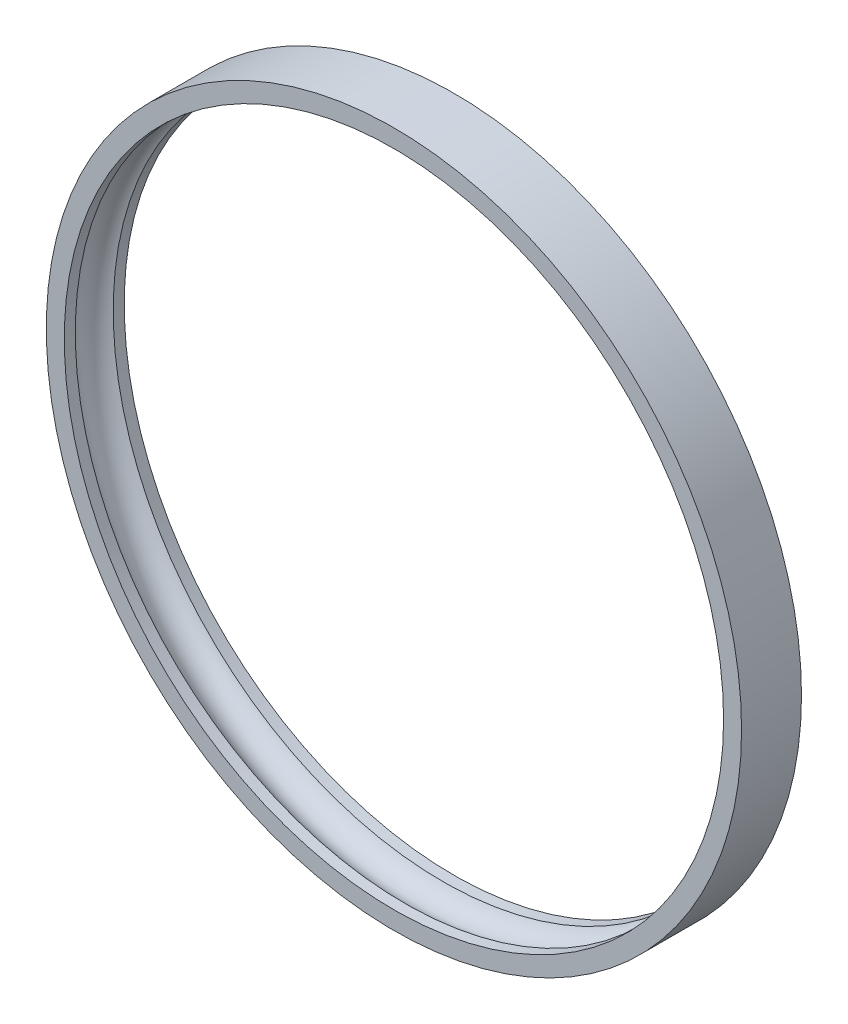
ISO-10303-21;
HEADER;
FILE_DESCRIPTION(('STEP AP214'),'2;1');
FILE_NAME('part.step','',(''),(''),'','','');
FILE_SCHEMA(('AUTOMOTIVE_DESIGN { 1 0 10303 214 1 1 1 1 }'));
ENDSEC;
DATA;
#1=APPLICATION_CONTEXT('core data for automotive mechanical design processes');
#2=APPLICATION_PROTOCOL_DEFINITION('international standard','automotive_design',2000,#1);
#3=PRODUCT_CONTEXT('',#1,'mechanical');
#4=PRODUCT('Part','Part','',(#3));
#5=PRODUCT_RELATED_PRODUCT_CATEGORY('part','',(#4));
#6=PRODUCT_DEFINITION_FORMATION('','',#4);
#7=PRODUCT_DEFINITION_CONTEXT('part definition',#1,'design');
#8=PRODUCT_DEFINITION('design','',#6,#7);
#9=PRODUCT_DEFINITION_SHAPE('','',#8);
#10=(LENGTH_UNIT() NAMED_UNIT(*) SI_UNIT(.MILLI.,.METRE.));
#11=(NAMED_UNIT(*) PLANE_ANGLE_UNIT() SI_UNIT($,.RADIAN.));
#12=(NAMED_UNIT(*) SI_UNIT($,.STERADIAN.) SOLID_ANGLE_UNIT());
#13=UNCERTAINTY_MEASURE_WITH_UNIT(LENGTH_MEASURE(1.E-05),#10,'distance_accuracy_value','');
#14=(GEOMETRIC_REPRESENTATION_CONTEXT(3) GLOBAL_UNCERTAINTY_ASSIGNED_CONTEXT((#13)) GLOBAL_UNIT_ASSIGNED_CONTEXT((#10,
#11,#12)) REPRESENTATION_CONTEXT('',''));
#15=CARTESIAN_POINT('',(0.,0.,0.));
#16=DIRECTION('',(0.,0.,1.));
#17=DIRECTION('',(1.,0.,0.));
#18=AXIS2_PLACEMENT_3D('',#15,#16,#17);
#19=CARTESIAN_POINT('',(0.,-110.,0.));
#20=DIRECTION('',(0.,0.,1.));
#21=DIRECTION('',(1.,0.,0.));
#22=AXIS2_PLACEMENT_3D('',#19,#20,#21);
#23=CYLINDRICAL_SURFACE('',#22,110.);
#24=CARTESIAN_POINT('',(0.,-110.,6.32455532033676));
#25=DIRECTION('',(0.,0.,1.));
#26=DIRECTION('',(1.,0.,0.));
#27=AXIS2_PLACEMENT_3D('',#24,#25,#26);
#28=CIRCLE('',#27,110.);
#29=CARTESIAN_POINT('',(110.,-110.,6.32455532033676));
#30=VERTEX_POINT('',#29);
#31=EDGE_CURVE('E11',#30,#30,#28,.T.);
#32=ORIENTED_EDGE('',*,*,#31,.F.);
#33=EDGE_LOOP('',(#32));
#34=FACE_BOUND('',#33,.T.);
#35=CARTESIAN_POINT('',(0.,-110.,10.));
#36=DIRECTION('',(0.,0.,1.));
#37=DIRECTION('',(1.,0.,0.));
#38=AXIS2_PLACEMENT_3D('',#35,#36,#37);
#39=CIRCLE('',#38,110.);
#40=CARTESIAN_POINT('',(110.,-110.,10.));
#41=VERTEX_POINT('',#40);
#42=EDGE_CURVE('E68',#41,#41,#39,.T.);
#43=ORIENTED_EDGE('',*,*,#42,.T.);
#44=EDGE_LOOP('',(#43));
#45=FACE_BOUND('',#44,.T.);
#46=ADVANCED_FACE('F41',(#34,#45),#23,.F.);
#47=CARTESIAN_POINT('',(0.,-110.,0.));
#48=DIRECTION('',(0.,0.,1.));
#49=DIRECTION('',(1.,0.,0.));
#50=AXIS2_PLACEMENT_3D('',#47,#48,#49);
#51=TOROIDAL_SURFACE('',#50,107.,7.);
#52=CARTESIAN_POINT('',(0.,-110.,-6.32455532033676));
#53=DIRECTION('',(0.,0.,1.));
#54=DIRECTION('',(1.,0.,0.));
#55=AXIS2_PLACEMENT_3D('',#52,#53,#54);
#56=CIRCLE('',#55,110.);
#57=CARTESIAN_POINT('',(110.,-110.,-6.32455532033676));
#58=VERTEX_POINT('',#57);
#59=EDGE_CURVE('E48',#58,#58,#56,.T.);
#60=ORIENTED_EDGE('',*,*,#59,.F.);
#61=EDGE_LOOP('',(#60));
#62=FACE_BOUND('',#61,.T.);
#63=ORIENTED_EDGE('',*,*,#31,.T.);
#64=EDGE_LOOP('',(#63));
#65=FACE_BOUND('',#64,.T.);
#66=ADVANCED_FACE('F94',(#62,#65),#51,.F.);
#67=CARTESIAN_POINT('',(0.,-110.,0.));
#68=DIRECTION('',(0.,0.,1.));
#69=DIRECTION('',(1.,0.,0.));
#70=AXIS2_PLACEMENT_3D('',#67,#68,#69);
#71=CYLINDRICAL_SURFACE('',#70,110.);
#72=CARTESIAN_POINT('',(0.,-110.,-10.));
#73=DIRECTION('',(0.,0.,1.));
#74=DIRECTION('',(1.,0.,0.));
#75=AXIS2_PLACEMENT_3D('',#72,#73,#74);
#76=CIRCLE('',#75,110.);
#77=CARTESIAN_POINT('',(110.,-110.,-10.));
#78=VERTEX_POINT('',#77);
#79=EDGE_CURVE('E53',#78,#78,#76,.T.);
#80=ORIENTED_EDGE('',*,*,#79,.F.);
#81=EDGE_LOOP('',(#80));
#82=FACE_BOUND('',#81,.T.);
#83=ORIENTED_EDGE('',*,*,#59,.T.);
#84=EDGE_LOOP('',(#83));
#85=FACE_BOUND('',#84,.T.);
#86=ADVANCED_FACE('F89',(#82,#85),#71,.F.);
#87=CARTESIAN_POINT('',(0.,6.,-10.));
#88=DIRECTION('',(0.,0.,1.));
#89=DIRECTION('',(1.,0.,0.));
#90=AXIS2_PLACEMENT_3D('',#87,#88,#89);
#91=PLANE('',#90);
#92=CARTESIAN_POINT('',(0.,-110.,-10.));
#93=DIRECTION('',(0.,0.,1.));
#94=DIRECTION('',(1.,0.,0.));
#95=AXIS2_PLACEMENT_3D('',#92,#93,#94);
#96=CIRCLE('',#95,116.);
#97=CARTESIAN_POINT('',(116.,-110.,-10.));
#98=VERTEX_POINT('',#97);
#99=EDGE_CURVE('E58',#98,#98,#96,.T.);
#100=ORIENTED_EDGE('',*,*,#99,.F.);
#101=EDGE_LOOP('',(#100));
#102=FACE_BOUND('',#101,.T.);
#103=ORIENTED_EDGE('',*,*,#79,.T.);
#104=EDGE_LOOP('',(#103));
#105=FACE_BOUND('',#104,.T.);
#106=ADVANCED_FACE('F83',(#102,#105),#91,.F.);
#107=CARTESIAN_POINT('',(0.,-110.,0.));
#108=DIRECTION('',(0.,0.,1.));
#109=DIRECTION('',(1.,0.,0.));
#110=AXIS2_PLACEMENT_3D('',#107,#108,#109);
#111=CYLINDRICAL_SURFACE('',#110,116.);
#112=CARTESIAN_POINT('',(0.,-110.,10.));
#113=DIRECTION('',(0.,0.,1.));
#114=DIRECTION('',(1.,0.,0.));
#115=AXIS2_PLACEMENT_3D('',#112,#113,#114);
#116=CIRCLE('',#115,116.);
#117=CARTESIAN_POINT('',(116.,-110.,10.));
#118=VERTEX_POINT('',#117);
#119=EDGE_CURVE('E64',#118,#118,#116,.T.);
#120=ORIENTED_EDGE('',*,*,#119,.F.);
#121=EDGE_LOOP('',(#120));
#122=FACE_BOUND('',#121,.T.);
#123=ORIENTED_EDGE('',*,*,#99,.T.);
#124=EDGE_LOOP('',(#123));
#125=FACE_BOUND('',#124,.T.);
#126=ADVANCED_FACE('F77',(#122,#125),#111,.T.);
#127=CARTESIAN_POINT('',(0.,6.,10.));
#128=DIRECTION('',(0.,0.,-1.));
#129=DIRECTION('',(-1.,0.,0.));
#130=AXIS2_PLACEMENT_3D('',#127,#128,#129);
#131=PLANE('',#130);
#132=ORIENTED_EDGE('',*,*,#42,.F.);
#133=EDGE_LOOP('',(#132));
#134=FACE_BOUND('',#133,.T.);
#135=ORIENTED_EDGE('',*,*,#119,.T.);
#136=EDGE_LOOP('',(#135));
#137=FACE_BOUND('',#136,.T.);
#138=ADVANCED_FACE('F74',(#134,#137),#131,.F.);
#139=CLOSED_SHELL('',(#46,#66,#86,#106,#126,#138));
#140=MANIFOLD_SOLID_BREP('B2',#139);
#141=ADVANCED_BREP_SHAPE_REPRESENTATION('',(#18,#140),#14);
#142=SHAPE_DEFINITION_REPRESENTATION(#9,#141);
ENDSEC;
END-ISO-10303-21;
